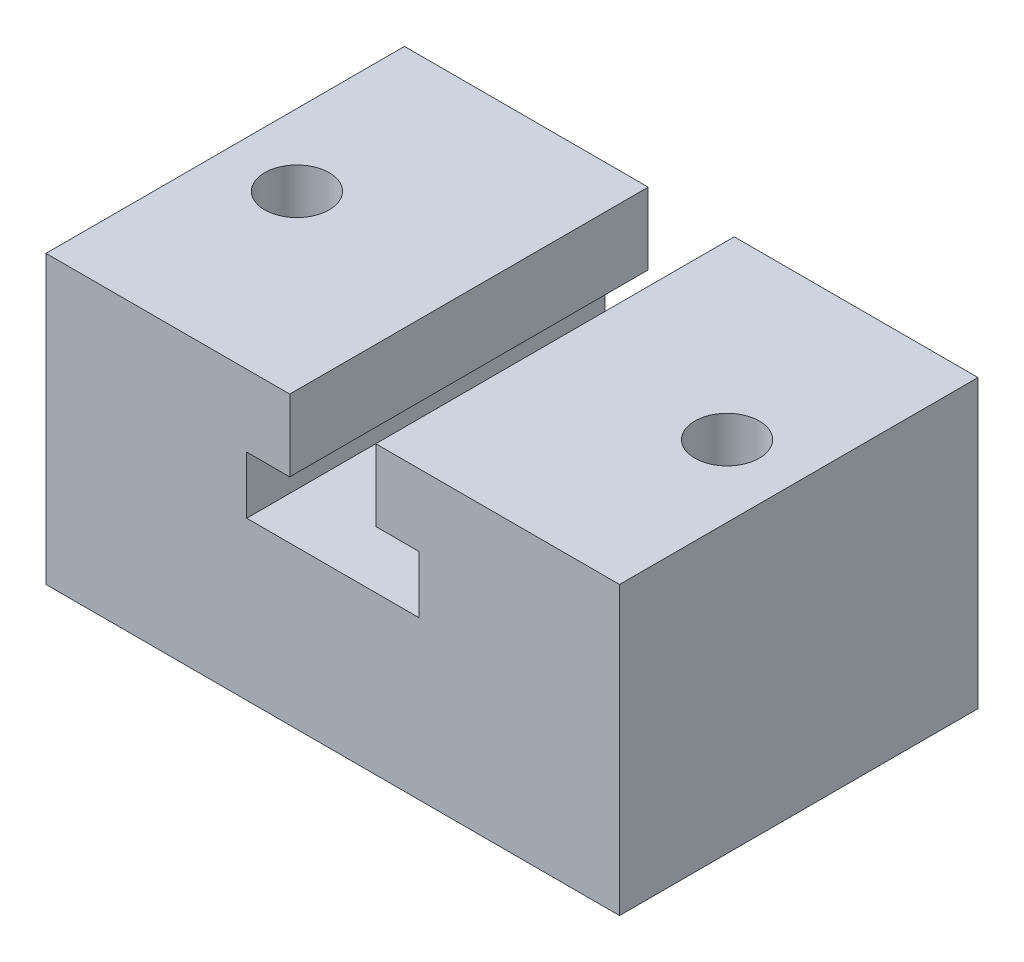
ISO-10303-21;
HEADER;
FILE_DESCRIPTION(('STEP AP214'),'2;1');
FILE_NAME('part.step','',(''),(''),'','','');
FILE_SCHEMA(('AUTOMOTIVE_DESIGN { 1 0 10303 214 1 1 1 1 }'));
ENDSEC;
DATA;
#1=APPLICATION_CONTEXT('core data for automotive mechanical design processes');
#2=APPLICATION_PROTOCOL_DEFINITION('international standard','automotive_design',2000,#1);
#3=PRODUCT_CONTEXT('',#1,'mechanical');
#4=PRODUCT('Part','Part','',(#3));
#5=PRODUCT_RELATED_PRODUCT_CATEGORY('part','',(#4));
#6=PRODUCT_DEFINITION_FORMATION('','',#4);
#7=PRODUCT_DEFINITION_CONTEXT('part definition',#1,'design');
#8=PRODUCT_DEFINITION('design','',#6,#7);
#9=PRODUCT_DEFINITION_SHAPE('','',#8);
#10=(LENGTH_UNIT() NAMED_UNIT(*) SI_UNIT(.MILLI.,.METRE.));
#11=(NAMED_UNIT(*) PLANE_ANGLE_UNIT() SI_UNIT($,.RADIAN.));
#12=(NAMED_UNIT(*) SI_UNIT($,.STERADIAN.) SOLID_ANGLE_UNIT());
#13=UNCERTAINTY_MEASURE_WITH_UNIT(LENGTH_MEASURE(1.E-05),#10,'distance_accuracy_value','');
#14=(GEOMETRIC_REPRESENTATION_CONTEXT(3) GLOBAL_UNCERTAINTY_ASSIGNED_CONTEXT((#13)) GLOBAL_UNIT_ASSIGNED_CONTEXT((#10,
#11,#12)) REPRESENTATION_CONTEXT('',''));
#15=CARTESIAN_POINT('',(0.,0.,0.));
#16=DIRECTION('',(0.,0.,1.));
#17=DIRECTION('',(1.,0.,0.));
#18=AXIS2_PLACEMENT_3D('',#15,#16,#17);
#19=CARTESIAN_POINT('',(40.,40.,25.));
#20=DIRECTION('',(0.,-1.,0.));
#21=DIRECTION('',(0.,0.,-1.));
#22=AXIS2_PLACEMENT_3D('',#19,#20,#21);
#23=PLANE('',#22);
#24=CARTESIAN_POINT('',(-30.,40.,0.));
#25=DIRECTION('',(0.,1.,0.));
#26=DIRECTION('',(0.,0.,1.));
#27=AXIS2_PLACEMENT_3D('',#24,#25,#26);
#28=CIRCLE('',#27,4.5);
#29=CARTESIAN_POINT('',(-30.,40.,4.5));
#30=VERTEX_POINT('',#29);
#31=EDGE_CURVE('E342',#30,#30,#28,.T.);
#32=ORIENTED_EDGE('',*,*,#31,.F.);
#33=EDGE_LOOP('',(#32));
#34=FACE_BOUND('',#33,.T.);
#35=DIRECTION('',(0.,0.,-1.));
#36=VECTOR('',#35,1.);
#37=CARTESIAN_POINT('',(-6.,40.,25.));
#38=LINE('',#37,#36);
#39=CARTESIAN_POINT('',(-6.,40.,25.));
#40=VERTEX_POINT('',#39);
#41=CARTESIAN_POINT('',(-6.,40.,-25.));
#42=VERTEX_POINT('',#41);
#43=EDGE_CURVE('E157',#40,#42,#38,.T.);
#44=ORIENTED_EDGE('',*,*,#43,.T.);
#45=DIRECTION('',(-1.,0.,0.));
#46=VECTOR('',#45,1.);
#47=CARTESIAN_POINT('',(40.,40.,-25.));
#48=LINE('',#47,#46);
#49=CARTESIAN_POINT('',(-40.,40.,-25.));
#50=VERTEX_POINT('',#49);
#51=EDGE_CURVE('E99',#42,#50,#48,.T.);
#52=ORIENTED_EDGE('',*,*,#51,.T.);
#53=DIRECTION('',(0.,0.,-1.));
#54=VECTOR('',#53,1.);
#55=CARTESIAN_POINT('',(-40.,40.,25.));
#56=LINE('',#55,#54);
#57=CARTESIAN_POINT('',(-40.,40.,25.));
#58=VERTEX_POINT('',#57);
#59=EDGE_CURVE('E249',#58,#50,#56,.T.);
#60=ORIENTED_EDGE('',*,*,#59,.F.);
#61=DIRECTION('',(-1.,0.,0.));
#62=VECTOR('',#61,1.);
#63=CARTESIAN_POINT('',(40.,40.,25.));
#64=LINE('',#63,#62);
#65=EDGE_CURVE('E77',#40,#58,#64,.T.);
#66=ORIENTED_EDGE('',*,*,#65,.F.);
#67=EDGE_LOOP('',(#44,#52,#60,#66));
#68=FACE_BOUND('',#67,.T.);
#69=ADVANCED_FACE('F51',(#34,#68),#23,.F.);
#70=CARTESIAN_POINT('',(30.,40.,0.));
#71=DIRECTION('',(0.,1.,0.));
#72=DIRECTION('',(0.,0.,1.));
#73=AXIS2_PLACEMENT_3D('',#70,#71,#72);
#74=CIRCLE('',#73,4.5);
#75=CARTESIAN_POINT('',(30.,40.,4.5));
#76=VERTEX_POINT('',#75);
#77=EDGE_CURVE('E344',#76,#76,#74,.T.);
#78=ORIENTED_EDGE('',*,*,#77,.F.);
#79=EDGE_LOOP('',(#78));
#80=FACE_BOUND('',#79,.T.);
#81=DIRECTION('',(0.,0.,-1.));
#82=VECTOR('',#81,1.);
#83=CARTESIAN_POINT('',(6.,40.,25.));
#84=LINE('',#83,#82);
#85=CARTESIAN_POINT('',(6.,40.,25.));
#86=VERTEX_POINT('',#85);
#87=CARTESIAN_POINT('',(6.,40.,-25.));
#88=VERTEX_POINT('',#87);
#89=EDGE_CURVE('E68',#86,#88,#84,.T.);
#90=ORIENTED_EDGE('',*,*,#89,.F.);
#91=CARTESIAN_POINT('',(40.,40.,25.));
#92=VERTEX_POINT('',#91);
#93=EDGE_CURVE('E245',#92,#86,#64,.T.);
#94=ORIENTED_EDGE('',*,*,#93,.F.);
#95=DIRECTION('',(0.,0.,-1.));
#96=VECTOR('',#95,1.);
#97=CARTESIAN_POINT('',(40.,40.,25.));
#98=LINE('',#97,#96);
#99=CARTESIAN_POINT('',(40.,40.,-25.));
#100=VERTEX_POINT('',#99);
#101=EDGE_CURVE('E264',#92,#100,#98,.T.);
#102=ORIENTED_EDGE('',*,*,#101,.T.);
#103=EDGE_CURVE('E240',#100,#88,#48,.T.);
#104=ORIENTED_EDGE('',*,*,#103,.T.);
#105=EDGE_LOOP('',(#90,#94,#102,#104));
#106=FACE_BOUND('',#105,.T.);
#107=ADVANCED_FACE('F279',(#80,#106),#23,.F.);
#108=CARTESIAN_POINT('',(0.,0.,25.));
#109=DIRECTION('',(0.,0.,1.));
#110=DIRECTION('',(1.,0.,0.));
#111=AXIS2_PLACEMENT_3D('',#108,#109,#110);
#112=PLANE('',#111);
#113=DIRECTION('',(-1.,0.,0.));
#114=VECTOR('',#113,1.);
#115=CARTESIAN_POINT('',(-12.,30.,25.));
#116=LINE('',#115,#114);
#117=CARTESIAN_POINT('',(-6.,30.,25.));
#118=VERTEX_POINT('',#117);
#119=CARTESIAN_POINT('',(-12.,30.,25.));
#120=VERTEX_POINT('',#119);
#121=EDGE_CURVE('E160',#118,#120,#116,.T.);
#122=ORIENTED_EDGE('',*,*,#121,.F.);
#123=DIRECTION('',(0.,-1.,0.));
#124=VECTOR('',#123,1.);
#125=CARTESIAN_POINT('',(-6.,30.,25.));
#126=LINE('',#125,#124);
#127=EDGE_CURVE('E152',#40,#118,#126,.T.);
#128=ORIENTED_EDGE('',*,*,#127,.F.);
#129=ORIENTED_EDGE('',*,*,#65,.T.);
#130=DIRECTION('',(0.,-1.,0.));
#131=VECTOR('',#130,1.);
#132=CARTESIAN_POINT('',(-40.,40.,25.));
#133=LINE('',#132,#131);
#134=CARTESIAN_POINT('',(-40.,0.,25.));
#135=VERTEX_POINT('',#134);
#136=EDGE_CURVE('E237',#58,#135,#133,.T.);
#137=ORIENTED_EDGE('',*,*,#136,.T.);
#138=DIRECTION('',(1.,0.,0.));
#139=VECTOR('',#138,1.);
#140=CARTESIAN_POINT('',(-40.,0.,25.));
#141=LINE('',#140,#139);
#142=CARTESIAN_POINT('',(40.,0.,25.));
#143=VERTEX_POINT('',#142);
#144=EDGE_CURVE('E106',#135,#143,#141,.T.);
#145=ORIENTED_EDGE('',*,*,#144,.T.);
#146=DIRECTION('',(0.,1.,0.));
#147=VECTOR('',#146,1.);
#148=CARTESIAN_POINT('',(40.,0.,25.));
#149=LINE('',#148,#147);
#150=EDGE_CURVE('E242',#143,#92,#149,.T.);
#151=ORIENTED_EDGE('',*,*,#150,.T.);
#152=ORIENTED_EDGE('',*,*,#93,.T.);
#153=DIRECTION('',(0.,1.,0.));
#154=VECTOR('',#153,1.);
#155=CARTESIAN_POINT('',(6.,40.,25.));
#156=LINE('',#155,#154);
#157=CARTESIAN_POINT('',(6.,30.,25.));
#158=VERTEX_POINT('',#157);
#159=EDGE_CURVE('E192',#158,#86,#156,.T.);
#160=ORIENTED_EDGE('',*,*,#159,.F.);
#161=DIRECTION('',(-1.,0.,0.));
#162=VECTOR('',#161,1.);
#163=CARTESIAN_POINT('',(6.,30.,25.));
#164=LINE('',#163,#162);
#165=CARTESIAN_POINT('',(12.,30.,25.));
#166=VERTEX_POINT('',#165);
#167=EDGE_CURVE('E189',#166,#158,#164,.T.);
#168=ORIENTED_EDGE('',*,*,#167,.F.);
#169=DIRECTION('',(0.,1.,0.));
#170=VECTOR('',#169,1.);
#171=CARTESIAN_POINT('',(12.,30.,25.));
#172=LINE('',#171,#170);
#173=CARTESIAN_POINT('',(12.,22.,25.));
#174=VERTEX_POINT('',#173);
#175=EDGE_CURVE('E186',#174,#166,#172,.T.);
#176=ORIENTED_EDGE('',*,*,#175,.F.);
#177=DIRECTION('',(1.,0.,0.));
#178=VECTOR('',#177,1.);
#179=CARTESIAN_POINT('',(12.,22.,25.));
#180=LINE('',#179,#178);
#181=CARTESIAN_POINT('',(-12.,22.,25.));
#182=VERTEX_POINT('',#181);
#183=EDGE_CURVE('E180',#182,#174,#180,.T.);
#184=ORIENTED_EDGE('',*,*,#183,.F.);
#185=DIRECTION('',(0.,-1.,0.));
#186=VECTOR('',#185,1.);
#187=CARTESIAN_POINT('',(-12.,22.,25.));
#188=LINE('',#187,#186);
#189=EDGE_CURVE('E175',#120,#182,#188,.T.);
#190=ORIENTED_EDGE('',*,*,#189,.F.);
#191=EDGE_LOOP('',(#122,#128,#129,#137,#145,#151,#152,#160,#168,#176,#184,#190));
#192=FACE_BOUND('',#191,.T.);
#193=ADVANCED_FACE('F173',(#192),#112,.T.);
#194=CARTESIAN_POINT('',(0.,0.,-25.));
#195=DIRECTION('',(0.,0.,1.));
#196=DIRECTION('',(1.,0.,0.));
#197=AXIS2_PLACEMENT_3D('',#194,#195,#196);
#198=PLANE('',#197);
#199=DIRECTION('',(0.,-1.,0.));
#200=VECTOR('',#199,1.);
#201=CARTESIAN_POINT('',(-6.,30.,-25.));
#202=LINE('',#201,#200);
#203=CARTESIAN_POINT('',(-6.,30.,-25.));
#204=VERTEX_POINT('',#203);
#205=EDGE_CURVE('E195',#42,#204,#202,.T.);
#206=ORIENTED_EDGE('',*,*,#205,.T.);
#207=DIRECTION('',(-1.,0.,0.));
#208=VECTOR('',#207,1.);
#209=CARTESIAN_POINT('',(-12.,30.,-25.));
#210=LINE('',#209,#208);
#211=CARTESIAN_POINT('',(-12.,30.,-25.));
#212=VERTEX_POINT('',#211);
#213=EDGE_CURVE('E167',#204,#212,#210,.T.);
#214=ORIENTED_EDGE('',*,*,#213,.T.);
#215=DIRECTION('',(0.,-1.,0.));
#216=VECTOR('',#215,1.);
#217=CARTESIAN_POINT('',(-12.,22.,-25.));
#218=LINE('',#217,#216);
#219=CARTESIAN_POINT('',(-12.,22.,-25.));
#220=VERTEX_POINT('',#219);
#221=EDGE_CURVE('E201',#212,#220,#218,.T.);
#222=ORIENTED_EDGE('',*,*,#221,.T.);
#223=DIRECTION('',(1.,0.,0.));
#224=VECTOR('',#223,1.);
#225=CARTESIAN_POINT('',(12.,22.,-25.));
#226=LINE('',#225,#224);
#227=CARTESIAN_POINT('',(12.,22.,-25.));
#228=VERTEX_POINT('',#227);
#229=EDGE_CURVE('E205',#220,#228,#226,.T.);
#230=ORIENTED_EDGE('',*,*,#229,.T.);
#231=DIRECTION('',(0.,1.,0.));
#232=VECTOR('',#231,1.);
#233=CARTESIAN_POINT('',(12.,30.,-25.));
#234=LINE('',#233,#232);
#235=CARTESIAN_POINT('',(12.,30.,-25.));
#236=VERTEX_POINT('',#235);
#237=EDGE_CURVE('E209',#228,#236,#234,.T.);
#238=ORIENTED_EDGE('',*,*,#237,.T.);
#239=DIRECTION('',(-1.,0.,0.));
#240=VECTOR('',#239,1.);
#241=CARTESIAN_POINT('',(6.,30.,-25.));
#242=LINE('',#241,#240);
#243=CARTESIAN_POINT('',(6.,30.,-25.));
#244=VERTEX_POINT('',#243);
#245=EDGE_CURVE('E213',#236,#244,#242,.T.);
#246=ORIENTED_EDGE('',*,*,#245,.T.);
#247=DIRECTION('',(0.,1.,0.));
#248=VECTOR('',#247,1.);
#249=CARTESIAN_POINT('',(6.,40.,-25.));
#250=LINE('',#249,#248);
#251=EDGE_CURVE('E161',#244,#88,#250,.T.);
#252=ORIENTED_EDGE('',*,*,#251,.T.);
#253=ORIENTED_EDGE('',*,*,#103,.F.);
#254=DIRECTION('',(0.,1.,0.));
#255=VECTOR('',#254,1.);
#256=CARTESIAN_POINT('',(40.,0.,-25.));
#257=LINE('',#256,#255);
#258=CARTESIAN_POINT('',(40.,0.,-25.));
#259=VERTEX_POINT('',#258);
#260=EDGE_CURVE('E256',#259,#100,#257,.T.);
#261=ORIENTED_EDGE('',*,*,#260,.F.);
#262=DIRECTION('',(1.,0.,0.));
#263=VECTOR('',#262,1.);
#264=CARTESIAN_POINT('',(-40.,0.,-25.));
#265=LINE('',#264,#263);
#266=CARTESIAN_POINT('',(-40.,0.,-25.));
#267=VERTEX_POINT('',#266);
#268=EDGE_CURVE('E253',#267,#259,#265,.T.);
#269=ORIENTED_EDGE('',*,*,#268,.F.);
#270=DIRECTION('',(0.,-1.,0.));
#271=VECTOR('',#270,1.);
#272=CARTESIAN_POINT('',(-40.,40.,-25.));
#273=LINE('',#272,#271);
#274=EDGE_CURVE('E169',#50,#267,#273,.T.);
#275=ORIENTED_EDGE('',*,*,#274,.F.);
#276=ORIENTED_EDGE('',*,*,#51,.F.);
#277=EDGE_LOOP('',(#206,#214,#222,#230,#238,#246,#252,#253,#261,#269,#275,#276));
#278=FACE_BOUND('',#277,.T.);
#279=ADVANCED_FACE('F276',(#278),#198,.F.);
#280=CARTESIAN_POINT('',(-40.,40.,25.));
#281=DIRECTION('',(1.,0.,0.));
#282=DIRECTION('',(0.,0.,-1.));
#283=AXIS2_PLACEMENT_3D('',#280,#281,#282);
#284=PLANE('',#283);
#285=ORIENTED_EDGE('',*,*,#274,.T.);
#286=DIRECTION('',(0.,0.,-1.));
#287=VECTOR('',#286,1.);
#288=CARTESIAN_POINT('',(-40.,0.,25.));
#289=LINE('',#288,#287);
#290=EDGE_CURVE('E11',#135,#267,#289,.T.);
#291=ORIENTED_EDGE('',*,*,#290,.F.);
#292=ORIENTED_EDGE('',*,*,#136,.F.);
#293=ORIENTED_EDGE('',*,*,#59,.T.);
#294=EDGE_LOOP('',(#285,#291,#292,#293));
#295=FACE_BOUND('',#294,.T.);
#296=ADVANCED_FACE('F54',(#295),#284,.F.);
#297=CARTESIAN_POINT('',(-40.,0.,25.));
#298=DIRECTION('',(0.,1.,0.));
#299=DIRECTION('',(0.,0.,1.));
#300=AXIS2_PLACEMENT_3D('',#297,#298,#299);
#301=PLANE('',#300);
#302=CARTESIAN_POINT('',(-30.,0.,0.));
#303=DIRECTION('',(0.,1.,0.));
#304=DIRECTION('',(0.,0.,1.));
#305=AXIS2_PLACEMENT_3D('',#302,#303,#304);
#306=CIRCLE('',#305,4.5);
#307=CARTESIAN_POINT('',(-30.,0.,4.5));
#308=VERTEX_POINT('',#307);
#309=EDGE_CURVE('E198',#308,#308,#306,.T.);
#310=ORIENTED_EDGE('',*,*,#309,.T.);
#311=EDGE_LOOP('',(#310));
#312=FACE_BOUND('',#311,.T.);
#313=CARTESIAN_POINT('',(30.,0.,0.));
#314=DIRECTION('',(0.,1.,0.));
#315=DIRECTION('',(0.,0.,1.));
#316=AXIS2_PLACEMENT_3D('',#313,#314,#315);
#317=CIRCLE('',#316,4.5);
#318=CARTESIAN_POINT('',(30.,0.,4.5));
#319=VERTEX_POINT('',#318);
#320=EDGE_CURVE('E350',#319,#319,#317,.T.);
#321=ORIENTED_EDGE('',*,*,#320,.T.);
#322=EDGE_LOOP('',(#321));
#323=FACE_BOUND('',#322,.T.);
#324=ORIENTED_EDGE('',*,*,#268,.T.);
#325=DIRECTION('',(0.,0.,-1.));
#326=VECTOR('',#325,1.);
#327=CARTESIAN_POINT('',(40.,0.,25.));
#328=LINE('',#327,#326);
#329=EDGE_CURVE('E61',#143,#259,#328,.T.);
#330=ORIENTED_EDGE('',*,*,#329,.F.);
#331=ORIENTED_EDGE('',*,*,#144,.F.);
#332=ORIENTED_EDGE('',*,*,#290,.T.);
#333=EDGE_LOOP('',(#324,#330,#331,#332));
#334=FACE_BOUND('',#333,.T.);
#335=ADVANCED_FACE('F286',(#312,#323,#334),#301,.F.);
#336=CARTESIAN_POINT('',(40.,0.,25.));
#337=DIRECTION('',(-1.,0.,0.));
#338=DIRECTION('',(0.,0.,1.));
#339=AXIS2_PLACEMENT_3D('',#336,#337,#338);
#340=PLANE('',#339);
#341=ORIENTED_EDGE('',*,*,#260,.T.);
#342=ORIENTED_EDGE('',*,*,#101,.F.);
#343=ORIENTED_EDGE('',*,*,#150,.F.);
#344=ORIENTED_EDGE('',*,*,#329,.T.);
#345=EDGE_LOOP('',(#341,#342,#343,#344));
#346=FACE_BOUND('',#345,.T.);
#347=ADVANCED_FACE('F272',(#346),#340,.F.);
#348=CARTESIAN_POINT('',(-6.,30.,25.));
#349=DIRECTION('',(1.,0.,0.));
#350=DIRECTION('',(0.,0.,-1.));
#351=AXIS2_PLACEMENT_3D('',#348,#349,#350);
#352=PLANE('',#351);
#353=ORIENTED_EDGE('',*,*,#205,.F.);
#354=ORIENTED_EDGE('',*,*,#43,.F.);
#355=ORIENTED_EDGE('',*,*,#127,.T.);
#356=DIRECTION('',(0.,0.,-1.));
#357=VECTOR('',#356,1.);
#358=CARTESIAN_POINT('',(-6.,30.,25.));
#359=LINE('',#358,#357);
#360=EDGE_CURVE('E155',#118,#204,#359,.T.);
#361=ORIENTED_EDGE('',*,*,#360,.T.);
#362=EDGE_LOOP('',(#353,#354,#355,#361));
#363=FACE_BOUND('',#362,.T.);
#364=ADVANCED_FACE('F154',(#363),#352,.T.);
#365=CARTESIAN_POINT('',(-12.,30.,25.));
#366=DIRECTION('',(0.,-1.,0.));
#367=DIRECTION('',(0.,0.,-1.));
#368=AXIS2_PLACEMENT_3D('',#365,#366,#367);
#369=PLANE('',#368);
#370=ORIENTED_EDGE('',*,*,#213,.F.);
#371=ORIENTED_EDGE('',*,*,#360,.F.);
#372=ORIENTED_EDGE('',*,*,#121,.T.);
#373=DIRECTION('',(0.,0.,-1.));
#374=VECTOR('',#373,1.);
#375=CARTESIAN_POINT('',(-12.,30.,25.));
#376=LINE('',#375,#374);
#377=EDGE_CURVE('E170',#120,#212,#376,.T.);
#378=ORIENTED_EDGE('',*,*,#377,.T.);
#379=EDGE_LOOP('',(#370,#371,#372,#378));
#380=FACE_BOUND('',#379,.T.);
#381=ADVANCED_FACE('F164',(#380),#369,.T.);
#382=CARTESIAN_POINT('',(-12.,22.,25.));
#383=DIRECTION('',(1.,0.,0.));
#384=DIRECTION('',(0.,0.,-1.));
#385=AXIS2_PLACEMENT_3D('',#382,#383,#384);
#386=PLANE('',#385);
#387=ORIENTED_EDGE('',*,*,#221,.F.);
#388=ORIENTED_EDGE('',*,*,#377,.F.);
#389=ORIENTED_EDGE('',*,*,#189,.T.);
#390=DIRECTION('',(0.,0.,-1.));
#391=VECTOR('',#390,1.);
#392=CARTESIAN_POINT('',(-12.,22.,25.));
#393=LINE('',#392,#391);
#394=EDGE_CURVE('E232',#182,#220,#393,.T.);
#395=ORIENTED_EDGE('',*,*,#394,.T.);
#396=EDGE_LOOP('',(#387,#388,#389,#395));
#397=FACE_BOUND('',#396,.T.);
#398=ADVANCED_FACE('F317',(#397),#386,.T.);
#399=CARTESIAN_POINT('',(12.,22.,25.));
#400=DIRECTION('',(0.,1.,0.));
#401=DIRECTION('',(0.,0.,1.));
#402=AXIS2_PLACEMENT_3D('',#399,#400,#401);
#403=PLANE('',#402);
#404=ORIENTED_EDGE('',*,*,#229,.F.);
#405=ORIENTED_EDGE('',*,*,#394,.F.);
#406=ORIENTED_EDGE('',*,*,#183,.T.);
#407=DIRECTION('',(0.,0.,-1.));
#408=VECTOR('',#407,1.);
#409=CARTESIAN_POINT('',(12.,22.,25.));
#410=LINE('',#409,#408);
#411=EDGE_CURVE('E229',#174,#228,#410,.T.);
#412=ORIENTED_EDGE('',*,*,#411,.T.);
#413=EDGE_LOOP('',(#404,#405,#406,#412));
#414=FACE_BOUND('',#413,.T.);
#415=ADVANCED_FACE('F320',(#414),#403,.T.);
#416=CARTESIAN_POINT('',(12.,30.,25.));
#417=DIRECTION('',(-1.,0.,0.));
#418=DIRECTION('',(0.,0.,1.));
#419=AXIS2_PLACEMENT_3D('',#416,#417,#418);
#420=PLANE('',#419);
#421=ORIENTED_EDGE('',*,*,#237,.F.);
#422=ORIENTED_EDGE('',*,*,#411,.F.);
#423=ORIENTED_EDGE('',*,*,#175,.T.);
#424=DIRECTION('',(0.,0.,-1.));
#425=VECTOR('',#424,1.);
#426=CARTESIAN_POINT('',(12.,30.,25.));
#427=LINE('',#426,#425);
#428=EDGE_CURVE('E226',#166,#236,#427,.T.);
#429=ORIENTED_EDGE('',*,*,#428,.T.);
#430=EDGE_LOOP('',(#421,#422,#423,#429));
#431=FACE_BOUND('',#430,.T.);
#432=ADVANCED_FACE('F323',(#431),#420,.T.);
#433=CARTESIAN_POINT('',(6.,30.,25.));
#434=DIRECTION('',(0.,-1.,0.));
#435=DIRECTION('',(0.,0.,-1.));
#436=AXIS2_PLACEMENT_3D('',#433,#434,#435);
#437=PLANE('',#436);
#438=ORIENTED_EDGE('',*,*,#245,.F.);
#439=ORIENTED_EDGE('',*,*,#428,.F.);
#440=ORIENTED_EDGE('',*,*,#167,.T.);
#441=DIRECTION('',(0.,0.,-1.));
#442=VECTOR('',#441,1.);
#443=CARTESIAN_POINT('',(6.,30.,25.));
#444=LINE('',#443,#442);
#445=EDGE_CURVE('E223',#158,#244,#444,.T.);
#446=ORIENTED_EDGE('',*,*,#445,.T.);
#447=EDGE_LOOP('',(#438,#439,#440,#446));
#448=FACE_BOUND('',#447,.T.);
#449=ADVANCED_FACE('F326',(#448),#437,.T.);
#450=CARTESIAN_POINT('',(6.,40.,25.));
#451=DIRECTION('',(-1.,0.,0.));
#452=DIRECTION('',(0.,0.,1.));
#453=AXIS2_PLACEMENT_3D('',#450,#451,#452);
#454=PLANE('',#453);
#455=ORIENTED_EDGE('',*,*,#251,.F.);
#456=ORIENTED_EDGE('',*,*,#445,.F.);
#457=ORIENTED_EDGE('',*,*,#159,.T.);
#458=ORIENTED_EDGE('',*,*,#89,.T.);
#459=EDGE_LOOP('',(#455,#456,#457,#458));
#460=FACE_BOUND('',#459,.T.);
#461=ADVANCED_FACE('F329',(#460),#454,.T.);
#462=CARTESIAN_POINT('',(30.,0.,0.));
#463=DIRECTION('',(0.,1.,0.));
#464=DIRECTION('',(0.,0.,1.));
#465=AXIS2_PLACEMENT_3D('',#462,#463,#464);
#466=CYLINDRICAL_SURFACE('',#465,4.5);
#467=ORIENTED_EDGE('',*,*,#320,.F.);
#468=EDGE_LOOP('',(#467));
#469=FACE_BOUND('',#468,.T.);
#470=ORIENTED_EDGE('',*,*,#77,.T.);
#471=EDGE_LOOP('',(#470));
#472=FACE_BOUND('',#471,.T.);
#473=ADVANCED_FACE('F331',(#469,#472),#466,.F.);
#474=CARTESIAN_POINT('',(-30.,0.,0.));
#475=DIRECTION('',(0.,1.,0.));
#476=DIRECTION('',(0.,0.,1.));
#477=AXIS2_PLACEMENT_3D('',#474,#475,#476);
#478=CYLINDRICAL_SURFACE('',#477,4.5);
#479=ORIENTED_EDGE('',*,*,#309,.F.);
#480=EDGE_LOOP('',(#479));
#481=FACE_BOUND('',#480,.T.);
#482=ORIENTED_EDGE('',*,*,#31,.T.);
#483=EDGE_LOOP('',(#482));
#484=FACE_BOUND('',#483,.T.);
#485=ADVANCED_FACE('F333',(#481,#484),#478,.F.);
#486=CLOSED_SHELL('',(#69,#107,#193,#279,#296,#335,#347,#364,#381,#398,#415,#432,#449,#461,#473,#485));
#487=MANIFOLD_SOLID_BREP('B2',#486);
#488=ADVANCED_BREP_SHAPE_REPRESENTATION('',(#18,#487),#14);
#489=SHAPE_DEFINITION_REPRESENTATION(#9,#488);
ENDSEC;
END-ISO-10303-21;
